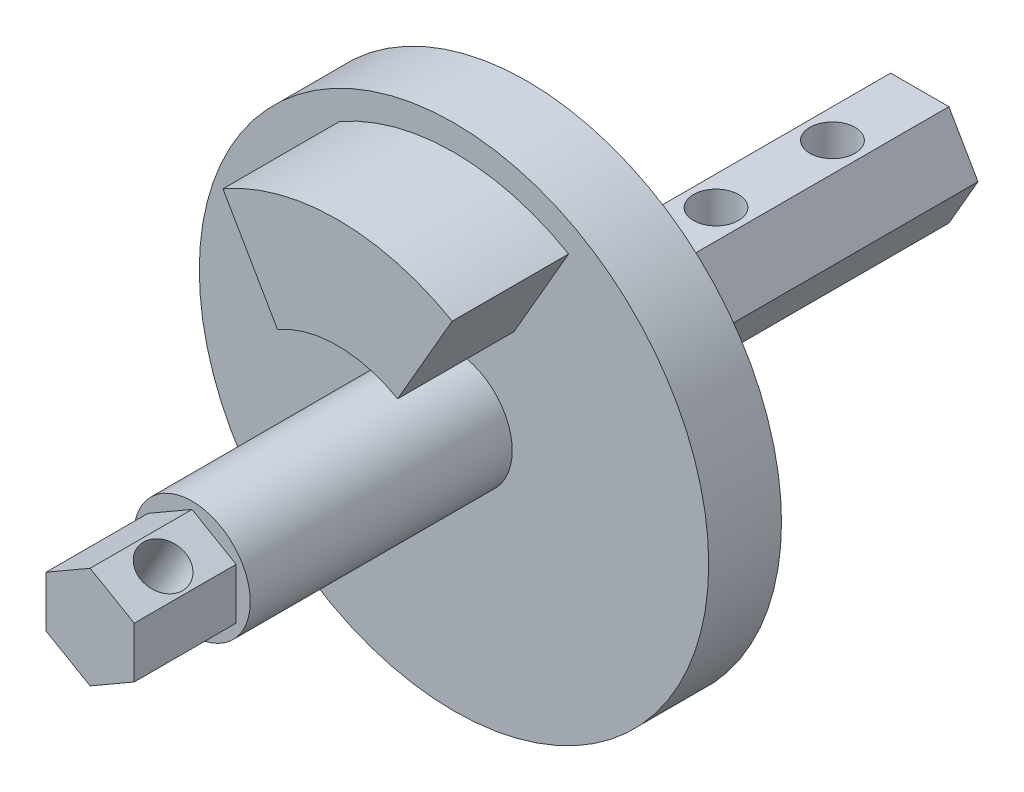
ISO-10303-21;
HEADER;
FILE_DESCRIPTION(('STEP AP214'),'2;1');
FILE_NAME('part.step','',(''),(''),'','','');
FILE_SCHEMA(('AUTOMOTIVE_DESIGN { 1 0 10303 214 1 1 1 1 }'));
ENDSEC;
DATA;
#1=APPLICATION_CONTEXT('core data for automotive mechanical design processes');
#2=APPLICATION_PROTOCOL_DEFINITION('international standard','automotive_design',2000,#1);
#3=PRODUCT_CONTEXT('',#1,'mechanical');
#4=PRODUCT('Part','Part','',(#3));
#5=PRODUCT_RELATED_PRODUCT_CATEGORY('part','',(#4));
#6=PRODUCT_DEFINITION_FORMATION('','',#4);
#7=PRODUCT_DEFINITION_CONTEXT('part definition',#1,'design');
#8=PRODUCT_DEFINITION('design','',#6,#7);
#9=PRODUCT_DEFINITION_SHAPE('','',#8);
#10=(LENGTH_UNIT() NAMED_UNIT(*) SI_UNIT(.MILLI.,.METRE.));
#11=(NAMED_UNIT(*) PLANE_ANGLE_UNIT() SI_UNIT($,.RADIAN.));
#12=(NAMED_UNIT(*) SI_UNIT($,.STERADIAN.) SOLID_ANGLE_UNIT());
#13=UNCERTAINTY_MEASURE_WITH_UNIT(LENGTH_MEASURE(1.E-05),#10,'distance_accuracy_value','');
#14=(GEOMETRIC_REPRESENTATION_CONTEXT(3) GLOBAL_UNCERTAINTY_ASSIGNED_CONTEXT((#13)) GLOBAL_UNIT_ASSIGNED_CONTEXT((#10,
#11,#12)) REPRESENTATION_CONTEXT('',''));
#15=CARTESIAN_POINT('',(0.,0.,0.));
#16=DIRECTION('',(0.,0.,1.));
#17=DIRECTION('',(1.,0.,0.));
#18=AXIS2_PLACEMENT_3D('',#15,#16,#17);
#19=CARTESIAN_POINT('',(0.,0.,-9.5));
#20=DIRECTION('',(0.,0.,-1.));
#21=DIRECTION('',(-1.,0.,0.));
#22=AXIS2_PLACEMENT_3D('',#19,#20,#21);
#23=PLANE('',#22);
#24=DIRECTION('',(-0.499999999999998,0.86602540378444,0.));
#25=VECTOR('',#24,1.);
#26=CARTESIAN_POINT('',(-2.00000000000002,-3.46410161513775,-9.5));
#27=LINE('',#26,#25);
#28=CARTESIAN_POINT('',(-2.00000000000001,-3.46410161513775,-9.5));
#29=VERTEX_POINT('',#28);
#30=CARTESIAN_POINT('',(-4.,0.,-9.5));
#31=VERTEX_POINT('',#30);
#32=EDGE_CURVE('E188',#29,#31,#27,.T.);
#33=ORIENTED_EDGE('',*,*,#32,.F.);
#34=CARTESIAN_POINT('',(0.,0.,-9.5));
#35=DIRECTION('',(0.,0.,-1.));
#36=DIRECTION('',(-1.,0.,0.));
#37=AXIS2_PLACEMENT_3D('',#34,#35,#36);
#38=CIRCLE('',#37,4.);
#39=EDGE_CURVE('E237',#29,#31,#38,.T.);
#40=ORIENTED_EDGE('',*,*,#39,.T.);
#41=EDGE_LOOP('',(#33,#40));
#42=FACE_BOUND('',#41,.T.);
#43=ADVANCED_FACE('F36',(#42),#23,.T.);
#44=DIRECTION('',(-1.,0.,0.));
#45=VECTOR('',#44,1.);
#46=CARTESIAN_POINT('',(1.99999999999999,-3.46410161513776,-9.5));
#47=LINE('',#46,#45);
#48=CARTESIAN_POINT('',(1.99999999999999,-3.46410161513776,-9.5));
#49=VERTEX_POINT('',#48);
#50=EDGE_CURVE('E193',#49,#29,#47,.T.);
#51=ORIENTED_EDGE('',*,*,#50,.F.);
#52=EDGE_CURVE('E355',#49,#29,#38,.T.);
#53=ORIENTED_EDGE('',*,*,#52,.T.);
#54=EDGE_LOOP('',(#51,#53));
#55=FACE_BOUND('',#54,.T.);
#56=ADVANCED_FACE('F298',(#55),#23,.T.);
#57=DIRECTION('',(-0.500000000000001,-0.866025403784438,0.));
#58=VECTOR('',#57,1.);
#59=CARTESIAN_POINT('',(4.,0.,-9.5));
#60=LINE('',#59,#58);
#61=CARTESIAN_POINT('',(4.,0.,-9.5));
#62=VERTEX_POINT('',#61);
#63=EDGE_CURVE('E215',#62,#49,#60,.T.);
#64=ORIENTED_EDGE('',*,*,#63,.F.);
#65=EDGE_CURVE('E357',#62,#49,#38,.T.);
#66=ORIENTED_EDGE('',*,*,#65,.T.);
#67=EDGE_LOOP('',(#64,#66));
#68=FACE_BOUND('',#67,.T.);
#69=ADVANCED_FACE('F305',(#68),#23,.T.);
#70=DIRECTION('',(0.499999999999998,-0.86602540378444,0.));
#71=VECTOR('',#70,1.);
#72=CARTESIAN_POINT('',(2.00000000000002,3.46410161513774,-9.5));
#73=LINE('',#72,#71);
#74=CARTESIAN_POINT('',(2.00000000000002,3.46410161513775,-9.5));
#75=VERTEX_POINT('',#74);
#76=EDGE_CURVE('E212',#75,#62,#73,.T.);
#77=ORIENTED_EDGE('',*,*,#76,.F.);
#78=EDGE_CURVE('E367',#75,#62,#38,.T.);
#79=ORIENTED_EDGE('',*,*,#78,.T.);
#80=EDGE_LOOP('',(#77,#79));
#81=FACE_BOUND('',#80,.T.);
#82=ADVANCED_FACE('F323',(#81),#23,.T.);
#83=DIRECTION('',(1.,0.,0.));
#84=VECTOR('',#83,1.);
#85=CARTESIAN_POINT('',(-1.99999999999999,3.46410161513776,-9.5));
#86=LINE('',#85,#84);
#87=CARTESIAN_POINT('',(-1.99999999999999,3.46410161513776,-9.5));
#88=VERTEX_POINT('',#87);
#89=EDGE_CURVE('E209',#88,#75,#86,.T.);
#90=ORIENTED_EDGE('',*,*,#89,.F.);
#91=EDGE_CURVE('E240',#88,#75,#38,.T.);
#92=ORIENTED_EDGE('',*,*,#91,.T.);
#93=EDGE_LOOP('',(#90,#92));
#94=FACE_BOUND('',#93,.T.);
#95=ADVANCED_FACE('F313',(#94),#23,.T.);
#96=CARTESIAN_POINT('',(0.,0.,2.5));
#97=DIRECTION('',(0.,0.,1.));
#98=DIRECTION('',(1.,0.,0.));
#99=AXIS2_PLACEMENT_3D('',#96,#97,#98);
#100=PLANE('',#99);
#101=CARTESIAN_POINT('',(0.,0.,2.5));
#102=DIRECTION('',(0.,0.,1.));
#103=DIRECTION('',(1.,0.,0.));
#104=AXIS2_PLACEMENT_3D('',#101,#102,#103);
#105=CIRCLE('',#104,4.);
#106=CARTESIAN_POINT('',(4.,0.,2.5));
#107=VERTEX_POINT('',#106);
#108=EDGE_CURVE('E239',#107,#107,#105,.T.);
#109=ORIENTED_EDGE('',*,*,#108,.F.);
#110=EDGE_LOOP('',(#109));
#111=FACE_BOUND('',#110,.T.);
#112=CARTESIAN_POINT('',(0.,0.,2.5));
#113=DIRECTION('',(0.,0.,1.));
#114=DIRECTION('',(1.,0.,0.));
#115=AXIS2_PLACEMENT_3D('',#112,#113,#114);
#116=CIRCLE('',#115,17.5);
#117=CARTESIAN_POINT('',(17.5,0.,2.5));
#118=VERTEX_POINT('',#117);
#119=EDGE_CURVE('E45',#118,#118,#116,.T.);
#120=ORIENTED_EDGE('',*,*,#119,.T.);
#121=EDGE_LOOP('',(#120));
#122=FACE_BOUND('',#121,.T.);
#123=DIRECTION('',(0.499999999999996,-0.866025403784441,0.));
#124=VECTOR('',#123,1.);
#125=CARTESIAN_POINT('',(-4.12499999999996,7.14470958122165,2.5));
#126=LINE('',#125,#124);
#127=CARTESIAN_POINT('',(-7.87499999999993,13.639900109605,2.5));
#128=VERTEX_POINT('',#127);
#129=CARTESIAN_POINT('',(-4.12499999999996,7.14470958122165,2.5));
#130=VERTEX_POINT('',#129);
#131=EDGE_CURVE('E261',#128,#130,#126,.T.);
#132=ORIENTED_EDGE('',*,*,#131,.F.);
#133=CARTESIAN_POINT('',(0.,0.,2.5));
#134=DIRECTION('',(0.,0.,1.));
#135=DIRECTION('',(-1.,0.,0.));
#136=AXIS2_PLACEMENT_3D('',#133,#134,#135);
#137=CIRCLE('',#136,15.75);
#138=CARTESIAN_POINT('',(7.87499999999993,13.639900109605,2.5));
#139=VERTEX_POINT('',#138);
#140=EDGE_CURVE('E245',#139,#128,#137,.T.);
#141=ORIENTED_EDGE('',*,*,#140,.F.);
#142=DIRECTION('',(0.499999999999995,0.866025403784441,0.));
#143=VECTOR('',#142,1.);
#144=CARTESIAN_POINT('',(7.87499999999993,13.639900109605,2.5));
#145=LINE('',#144,#143);
#146=CARTESIAN_POINT('',(4.12499999999996,7.14470958122164,2.5));
#147=VERTEX_POINT('',#146);
#148=EDGE_CURVE('E252',#147,#139,#145,.T.);
#149=ORIENTED_EDGE('',*,*,#148,.F.);
#150=CARTESIAN_POINT('',(0.,0.,2.5));
#151=DIRECTION('',(0.,0.,-1.));
#152=DIRECTION('',(1.,0.,0.));
#153=AXIS2_PLACEMENT_3D('',#150,#151,#152);
#154=CIRCLE('',#153,8.25);
#155=EDGE_CURVE('E263',#130,#147,#154,.T.);
#156=ORIENTED_EDGE('',*,*,#155,.F.);
#157=EDGE_LOOP('',(#132,#141,#149,#156));
#158=FACE_BOUND('',#157,.T.);
#159=ADVANCED_FACE('F293',(#111,#122,#158),#100,.T.);
#160=CARTESIAN_POINT('',(0.,0.,2.5));
#161=DIRECTION('',(0.,0.,-1.));
#162=DIRECTION('',(-1.,0.,0.));
#163=AXIS2_PLACEMENT_3D('',#160,#161,#162);
#164=CYLINDRICAL_SURFACE('',#163,17.5);
#165=ORIENTED_EDGE('',*,*,#119,.F.);
#166=EDGE_LOOP('',(#165));
#167=FACE_BOUND('',#166,.T.);
#168=CARTESIAN_POINT('',(0.,0.,-2.5));
#169=DIRECTION('',(0.,0.,1.));
#170=DIRECTION('',(1.,0.,0.));
#171=AXIS2_PLACEMENT_3D('',#168,#169,#170);
#172=CIRCLE('',#171,17.5);
#173=CARTESIAN_POINT('',(17.5,0.,-2.5));
#174=VERTEX_POINT('',#173);
#175=EDGE_CURVE('E40',#174,#174,#172,.T.);
#176=ORIENTED_EDGE('',*,*,#175,.T.);
#177=EDGE_LOOP('',(#176));
#178=FACE_BOUND('',#177,.T.);
#179=ADVANCED_FACE('F38',(#167,#178),#164,.T.);
#180=CARTESIAN_POINT('',(0.,0.,-2.5));
#181=DIRECTION('',(0.,0.,1.));
#182=DIRECTION('',(1.,0.,0.));
#183=AXIS2_PLACEMENT_3D('',#180,#181,#182);
#184=PLANE('',#183);
#185=CARTESIAN_POINT('',(0.,0.,-2.5));
#186=DIRECTION('',(0.,0.,-1.));
#187=DIRECTION('',(-1.,0.,0.));
#188=AXIS2_PLACEMENT_3D('',#185,#186,#187);
#189=CIRCLE('',#188,4.);
#190=CARTESIAN_POINT('',(-4.,0.,-2.5));
#191=VERTEX_POINT('',#190);
#192=EDGE_CURVE('E11',#191,#191,#189,.T.);
#193=ORIENTED_EDGE('',*,*,#192,.F.);
#194=EDGE_LOOP('',(#193));
#195=FACE_BOUND('',#194,.T.);
#196=ORIENTED_EDGE('',*,*,#175,.F.);
#197=EDGE_LOOP('',(#196));
#198=FACE_BOUND('',#197,.T.);
#199=ADVANCED_FACE('F282',(#195,#198),#184,.F.);
#200=CARTESIAN_POINT('',(0.,0.,10.5));
#201=DIRECTION('',(0.,0.,-1.));
#202=DIRECTION('',(-1.,0.,0.));
#203=AXIS2_PLACEMENT_3D('',#200,#201,#202);
#204=CYLINDRICAL_SURFACE('',#203,15.75);
#205=ORIENTED_EDGE('',*,*,#140,.T.);
#206=DIRECTION('',(0.,0.,-1.));
#207=VECTOR('',#206,1.);
#208=CARTESIAN_POINT('',(-7.87499999999993,13.639900109605,10.5));
#209=LINE('',#208,#207);
#210=CARTESIAN_POINT('',(-7.87499999999993,13.639900109605,10.5));
#211=VERTEX_POINT('',#210);
#212=EDGE_CURVE('E274',#211,#128,#209,.T.);
#213=ORIENTED_EDGE('',*,*,#212,.F.);
#214=CARTESIAN_POINT('',(0.,0.,10.5));
#215=DIRECTION('',(0.,0.,1.));
#216=DIRECTION('',(-1.,0.,0.));
#217=AXIS2_PLACEMENT_3D('',#214,#215,#216);
#218=CIRCLE('',#217,15.75);
#219=CARTESIAN_POINT('',(7.87499999999993,13.639900109605,10.5));
#220=VERTEX_POINT('',#219);
#221=EDGE_CURVE('E248',#220,#211,#218,.T.);
#222=ORIENTED_EDGE('',*,*,#221,.F.);
#223=DIRECTION('',(0.,0.,-1.));
#224=VECTOR('',#223,1.);
#225=CARTESIAN_POINT('',(7.87499999999993,13.639900109605,10.5));
#226=LINE('',#225,#224);
#227=EDGE_CURVE('E258',#220,#139,#226,.T.);
#228=ORIENTED_EDGE('',*,*,#227,.T.);
#229=EDGE_LOOP('',(#205,#213,#222,#228));
#230=FACE_BOUND('',#229,.T.);
#231=ADVANCED_FACE('F284',(#230),#204,.T.);
#232=CARTESIAN_POINT('',(-4.12499999999996,7.14470958122165,10.5));
#233=DIRECTION('',(0.866025403784441,0.499999999999996,0.));
#234=DIRECTION('',(-0.499999999999996,0.866025403784441,0.));
#235=AXIS2_PLACEMENT_3D('',#232,#233,#234);
#236=PLANE('',#235);
#237=ORIENTED_EDGE('',*,*,#131,.T.);
#238=DIRECTION('',(0.,0.,-1.));
#239=VECTOR('',#238,1.);
#240=CARTESIAN_POINT('',(-4.12499999999996,7.14470958122165,10.5));
#241=LINE('',#240,#239);
#242=CARTESIAN_POINT('',(-4.12499999999996,7.14470958122165,10.5));
#243=VERTEX_POINT('',#242);
#244=EDGE_CURVE('E271',#243,#130,#241,.T.);
#245=ORIENTED_EDGE('',*,*,#244,.F.);
#246=DIRECTION('',(0.499999999999996,-0.866025403784441,0.));
#247=VECTOR('',#246,1.);
#248=CARTESIAN_POINT('',(-4.12499999999996,7.14470958122165,10.5));
#249=LINE('',#248,#247);
#250=EDGE_CURVE('E251',#211,#243,#249,.T.);
#251=ORIENTED_EDGE('',*,*,#250,.F.);
#252=ORIENTED_EDGE('',*,*,#212,.T.);
#253=EDGE_LOOP('',(#237,#245,#251,#252));
#254=FACE_BOUND('',#253,.T.);
#255=ADVANCED_FACE('F290',(#254),#236,.F.);
#256=CARTESIAN_POINT('',(0.,0.,10.5));
#257=DIRECTION('',(0.,0.,-1.));
#258=DIRECTION('',(-1.,0.,0.));
#259=AXIS2_PLACEMENT_3D('',#256,#257,#258);
#260=CYLINDRICAL_SURFACE('',#259,8.25);
#261=ORIENTED_EDGE('',*,*,#155,.T.);
#262=DIRECTION('',(0.,0.,-1.));
#263=VECTOR('',#262,1.);
#264=CARTESIAN_POINT('',(4.12499999999996,7.14470958122164,10.5));
#265=LINE('',#264,#263);
#266=CARTESIAN_POINT('',(4.12499999999996,7.14470958122164,10.5));
#267=VERTEX_POINT('',#266);
#268=EDGE_CURVE('E269',#267,#147,#265,.T.);
#269=ORIENTED_EDGE('',*,*,#268,.F.);
#270=CARTESIAN_POINT('',(0.,0.,10.5));
#271=DIRECTION('',(0.,0.,-1.));
#272=DIRECTION('',(1.,0.,0.));
#273=AXIS2_PLACEMENT_3D('',#270,#271,#272);
#274=CIRCLE('',#273,8.25);
#275=EDGE_CURVE('E254',#243,#267,#274,.T.);
#276=ORIENTED_EDGE('',*,*,#275,.F.);
#277=ORIENTED_EDGE('',*,*,#244,.T.);
#278=EDGE_LOOP('',(#261,#269,#276,#277));
#279=FACE_BOUND('',#278,.T.);
#280=ADVANCED_FACE('F577',(#279),#260,.F.);
#281=CARTESIAN_POINT('',(7.87499999999993,13.639900109605,10.5));
#282=DIRECTION('',(-0.866025403784441,0.499999999999995,0.));
#283=DIRECTION('',(-0.499999999999995,-0.866025403784441,0.));
#284=AXIS2_PLACEMENT_3D('',#281,#282,#283);
#285=PLANE('',#284);
#286=ORIENTED_EDGE('',*,*,#148,.T.);
#287=ORIENTED_EDGE('',*,*,#227,.F.);
#288=DIRECTION('',(0.499999999999995,0.866025403784441,0.));
#289=VECTOR('',#288,1.);
#290=CARTESIAN_POINT('',(7.87499999999993,13.639900109605,10.5));
#291=LINE('',#290,#289);
#292=EDGE_CURVE('E256',#267,#220,#291,.T.);
#293=ORIENTED_EDGE('',*,*,#292,.F.);
#294=ORIENTED_EDGE('',*,*,#268,.T.);
#295=EDGE_LOOP('',(#286,#287,#293,#294));
#296=FACE_BOUND('',#295,.T.);
#297=ADVANCED_FACE('F584',(#296),#285,.F.);
#298=CARTESIAN_POINT('',(0.,0.,10.5));
#299=DIRECTION('',(0.,0.,-1.));
#300=DIRECTION('',(-1.,0.,0.));
#301=AXIS2_PLACEMENT_3D('',#298,#299,#300);
#302=PLANE('',#301);
#303=ORIENTED_EDGE('',*,*,#221,.T.);
#304=ORIENTED_EDGE('',*,*,#250,.T.);
#305=ORIENTED_EDGE('',*,*,#275,.T.);
#306=ORIENTED_EDGE('',*,*,#292,.T.);
#307=EDGE_LOOP('',(#303,#304,#305,#306));
#308=FACE_BOUND('',#307,.T.);
#309=ADVANCED_FACE('F564',(#308),#302,.F.);
#310=CARTESIAN_POINT('',(0.,0.,20.5));
#311=DIRECTION('',(0.,0.,-1.));
#312=DIRECTION('',(-1.,0.,0.));
#313=AXIS2_PLACEMENT_3D('',#310,#311,#312);
#314=CYLINDRICAL_SURFACE('',#313,4.);
#315=CARTESIAN_POINT('',(0.,0.,20.5));
#316=DIRECTION('',(0.,0.,1.));
#317=DIRECTION('',(1.,0.,0.));
#318=AXIS2_PLACEMENT_3D('',#315,#316,#317);
#319=CIRCLE('',#318,4.);
#320=CARTESIAN_POINT('',(4.,0.,20.5));
#321=VERTEX_POINT('',#320);
#322=EDGE_CURVE('E242',#321,#321,#319,.T.);
#323=ORIENTED_EDGE('',*,*,#322,.F.);
#324=EDGE_LOOP('',(#323));
#325=FACE_BOUND('',#324,.T.);
#326=ORIENTED_EDGE('',*,*,#108,.T.);
#327=EDGE_LOOP('',(#326));
#328=FACE_BOUND('',#327,.T.);
#329=ADVANCED_FACE('F436',(#325,#328),#314,.T.);
#330=CARTESIAN_POINT('',(0.,0.,20.5));
#331=DIRECTION('',(0.,0.,1.));
#332=DIRECTION('',(1.,0.,0.));
#333=AXIS2_PLACEMENT_3D('',#330,#331,#332);
#334=PLANE('',#333);
#335=DIRECTION('',(0.,1.,0.));
#336=VECTOR('',#335,1.);
#337=CARTESIAN_POINT('',(3.03108891324555,-1.74999999999998,20.5));
#338=LINE('',#337,#336);
#339=CARTESIAN_POINT('',(3.03108891324555,-1.74999999999998,20.5));
#340=VERTEX_POINT('',#339);
#341=CARTESIAN_POINT('',(3.03108891324555,1.74999999999998,20.5));
#342=VERTEX_POINT('',#341);
#343=EDGE_CURVE('E53',#340,#342,#338,.T.);
#344=ORIENTED_EDGE('',*,*,#343,.F.);
#345=DIRECTION('',(0.866025403784437,0.500000000000003,0.));
#346=VECTOR('',#345,1.);
#347=CARTESIAN_POINT('',(0.,-3.5,20.5));
#348=LINE('',#347,#346);
#349=CARTESIAN_POINT('',(0.,-3.5,20.5));
#350=VERTEX_POINT('',#349);
#351=EDGE_CURVE('E57',#350,#340,#348,.T.);
#352=ORIENTED_EDGE('',*,*,#351,.F.);
#353=DIRECTION('',(0.866025403784437,-0.500000000000003,0.));
#354=VECTOR('',#353,1.);
#355=CARTESIAN_POINT('',(-3.03108891324555,-1.74999999999998,20.5));
#356=LINE('',#355,#354);
#357=CARTESIAN_POINT('',(-3.03108891324555,-1.74999999999998,20.5));
#358=VERTEX_POINT('',#357);
#359=EDGE_CURVE('E544',#358,#350,#356,.T.);
#360=ORIENTED_EDGE('',*,*,#359,.F.);
#361=DIRECTION('',(0.,-1.,0.));
#362=VECTOR('',#361,1.);
#363=CARTESIAN_POINT('',(-3.03108891324555,1.74999999999998,20.5));
#364=LINE('',#363,#362);
#365=CARTESIAN_POINT('',(-3.03108891324555,1.74999999999998,20.5));
#366=VERTEX_POINT('',#365);
#367=EDGE_CURVE('E541',#366,#358,#364,.T.);
#368=ORIENTED_EDGE('',*,*,#367,.F.);
#369=DIRECTION('',(-0.866025403784437,-0.500000000000003,0.));
#370=VECTOR('',#369,1.);
#371=CARTESIAN_POINT('',(0.,3.5,20.5));
#372=LINE('',#371,#370);
#373=CARTESIAN_POINT('',(0.,3.5,20.5));
#374=VERTEX_POINT('',#373);
#375=EDGE_CURVE('E538',#374,#366,#372,.T.);
#376=ORIENTED_EDGE('',*,*,#375,.F.);
#377=DIRECTION('',(-0.866025403784437,0.500000000000003,0.));
#378=VECTOR('',#377,1.);
#379=CARTESIAN_POINT('',(3.03108891324555,1.74999999999998,20.5));
#380=LINE('',#379,#378);
#381=EDGE_CURVE('E526',#342,#374,#380,.T.);
#382=ORIENTED_EDGE('',*,*,#381,.F.);
#383=EDGE_LOOP('',(#344,#352,#360,#368,#376,#382));
#384=FACE_BOUND('',#383,.T.);
#385=ORIENTED_EDGE('',*,*,#322,.T.);
#386=EDGE_LOOP('',(#385));
#387=FACE_BOUND('',#386,.T.);
#388=ADVANCED_FACE('F320',(#384,#387),#334,.T.);
#389=CARTESIAN_POINT('',(0.,0.,-9.5));
#390=DIRECTION('',(0.,0.,1.));
#391=DIRECTION('',(1.,0.,0.));
#392=AXIS2_PLACEMENT_3D('',#389,#390,#391);
#393=CYLINDRICAL_SURFACE('',#392,4.);
#394=EDGE_CURVE('E238',#31,#88,#38,.T.);
#395=ORIENTED_EDGE('',*,*,#394,.F.);
#396=ORIENTED_EDGE('',*,*,#39,.F.);
#397=ORIENTED_EDGE('',*,*,#52,.F.);
#398=ORIENTED_EDGE('',*,*,#65,.F.);
#399=ORIENTED_EDGE('',*,*,#78,.F.);
#400=ORIENTED_EDGE('',*,*,#91,.F.);
#401=EDGE_LOOP('',(#395,#396,#397,#398,#399,#400));
#402=FACE_BOUND('',#401,.T.);
#403=ORIENTED_EDGE('',*,*,#192,.T.);
#404=EDGE_LOOP('',(#403));
#405=FACE_BOUND('',#404,.T.);
#406=ADVANCED_FACE('F311',(#402,#405),#393,.T.);
#407=DIRECTION('',(0.500000000000001,0.866025403784438,0.));
#408=VECTOR('',#407,1.);
#409=CARTESIAN_POINT('',(-4.,0.,-9.5));
#410=LINE('',#409,#408);
#411=EDGE_CURVE('E206',#31,#88,#410,.T.);
#412=ORIENTED_EDGE('',*,*,#411,.F.);
#413=ORIENTED_EDGE('',*,*,#394,.T.);
#414=EDGE_LOOP('',(#412,#413));
#415=FACE_BOUND('',#414,.T.);
#416=ADVANCED_FACE('F301',(#415),#23,.T.);
#417=CARTESIAN_POINT('',(-2.00000000000002,-3.46410161513775,-29.5));
#418=DIRECTION('',(0.86602540378444,0.499999999999997,0.));
#419=DIRECTION('',(-0.499999999999998,0.86602540378444,0.));
#420=AXIS2_PLACEMENT_3D('',#417,#418,#419);
#421=PLANE('',#420);
#422=ORIENTED_EDGE('',*,*,#32,.T.);
#423=DIRECTION('',(0.,0.,1.));
#424=VECTOR('',#423,1.);
#425=CARTESIAN_POINT('',(-4.,0.,-29.5));
#426=LINE('',#425,#424);
#427=CARTESIAN_POINT('',(-4.,0.,-29.5));
#428=VERTEX_POINT('',#427);
#429=EDGE_CURVE('E234',#428,#31,#426,.T.);
#430=ORIENTED_EDGE('',*,*,#429,.F.);
#431=DIRECTION('',(-0.499999999999998,0.86602540378444,0.));
#432=VECTOR('',#431,1.);
#433=CARTESIAN_POINT('',(-2.00000000000002,-3.46410161513775,-29.5));
#434=LINE('',#433,#432);
#435=CARTESIAN_POINT('',(-2.00000000000002,-3.46410161513775,-29.5));
#436=VERTEX_POINT('',#435);
#437=EDGE_CURVE('E189',#436,#428,#434,.T.);
#438=ORIENTED_EDGE('',*,*,#437,.F.);
#439=DIRECTION('',(0.,0.,1.));
#440=VECTOR('',#439,1.);
#441=CARTESIAN_POINT('',(-2.00000000000002,-3.46410161513775,-29.5));
#442=LINE('',#441,#440);
#443=EDGE_CURVE('E203',#436,#29,#442,.T.);
#444=ORIENTED_EDGE('',*,*,#443,.T.);
#445=EDGE_LOOP('',(#422,#430,#438,#444));
#446=FACE_BOUND('',#445,.T.);
#447=ADVANCED_FACE('F310',(#446),#421,.F.);
#448=CARTESIAN_POINT('',(-4.,0.,-29.5));
#449=DIRECTION('',(0.866025403784438,-0.500000000000001,0.));
#450=DIRECTION('',(0.500000000000001,0.866025403784438,0.));
#451=AXIS2_PLACEMENT_3D('',#448,#449,#450);
#452=PLANE('',#451);
#453=ORIENTED_EDGE('',*,*,#411,.T.);
#454=DIRECTION('',(0.,0.,1.));
#455=VECTOR('',#454,1.);
#456=CARTESIAN_POINT('',(-1.99999999999999,3.46410161513776,-29.5));
#457=LINE('',#456,#455);
#458=CARTESIAN_POINT('',(-1.99999999999999,3.46410161513776,-29.5));
#459=VERTEX_POINT('',#458);
#460=EDGE_CURVE('E231',#459,#88,#457,.T.);
#461=ORIENTED_EDGE('',*,*,#460,.F.);
#462=DIRECTION('',(0.500000000000001,0.866025403784438,0.));
#463=VECTOR('',#462,1.);
#464=CARTESIAN_POINT('',(-4.,0.,-29.5));
#465=LINE('',#464,#463);
#466=EDGE_CURVE('E192',#428,#459,#465,.T.);
#467=ORIENTED_EDGE('',*,*,#466,.F.);
#468=ORIENTED_EDGE('',*,*,#429,.T.);
#469=EDGE_LOOP('',(#453,#461,#467,#468));
#470=FACE_BOUND('',#469,.T.);
#471=ADVANCED_FACE('F318',(#470),#452,.F.);
#472=CARTESIAN_POINT('',(-1.99999999999999,3.46410161513776,-29.5));
#473=DIRECTION('',(0.,-1.,0.));
#474=DIRECTION('',(1.,0.,0.));
#475=AXIS2_PLACEMENT_3D('',#472,#473,#474);
#476=PLANE('',#475);
#477=CARTESIAN_POINT('',(0.,3.46410161513775,-15.5));
#478=DIRECTION('',(0.,-1.,0.));
#479=DIRECTION('',(1.,0.,0.));
#480=AXIS2_PLACEMENT_3D('',#477,#478,#479);
#481=CIRCLE('',#480,1.55);
#482=CARTESIAN_POINT('',(1.55000000000001,3.46410161513775,-15.5));
#483=VERTEX_POINT('',#482);
#484=EDGE_CURVE('E185',#483,#483,#481,.F.);
#485=ORIENTED_EDGE('',*,*,#484,.F.);
#486=EDGE_LOOP('',(#485));
#487=FACE_BOUND('',#486,.T.);
#488=CARTESIAN_POINT('',(0.,3.46410161513775,-23.5));
#489=DIRECTION('',(0.,-1.,0.));
#490=DIRECTION('',(1.,0.,0.));
#491=AXIS2_PLACEMENT_3D('',#488,#489,#490);
#492=CIRCLE('',#491,1.55000000000003);
#493=CARTESIAN_POINT('',(1.55000000000004,3.46410161513775,-23.5));
#494=VERTEX_POINT('',#493);
#495=EDGE_CURVE('E181',#494,#494,#492,.F.);
#496=ORIENTED_EDGE('',*,*,#495,.F.);
#497=EDGE_LOOP('',(#496));
#498=FACE_BOUND('',#497,.T.);
#499=ORIENTED_EDGE('',*,*,#89,.T.);
#500=DIRECTION('',(0.,0.,1.));
#501=VECTOR('',#500,1.);
#502=CARTESIAN_POINT('',(2.00000000000002,3.46410161513774,-29.5));
#503=LINE('',#502,#501);
#504=CARTESIAN_POINT('',(2.00000000000002,3.46410161513774,-29.5));
#505=VERTEX_POINT('',#504);
#506=EDGE_CURVE('E228',#505,#75,#503,.T.);
#507=ORIENTED_EDGE('',*,*,#506,.F.);
#508=DIRECTION('',(1.,0.,0.));
#509=VECTOR('',#508,1.);
#510=CARTESIAN_POINT('',(-1.99999999999999,3.46410161513776,-29.5));
#511=LINE('',#510,#509);
#512=EDGE_CURVE('E195',#459,#505,#511,.T.);
#513=ORIENTED_EDGE('',*,*,#512,.F.);
#514=ORIENTED_EDGE('',*,*,#460,.T.);
#515=EDGE_LOOP('',(#499,#507,#513,#514));
#516=FACE_BOUND('',#515,.T.);
#517=ADVANCED_FACE('F341',(#487,#498,#516),#476,.F.);
#518=CARTESIAN_POINT('',(2.00000000000002,3.46410161513774,-29.5));
#519=DIRECTION('',(-0.86602540378444,-0.499999999999998,0.));
#520=DIRECTION('',(0.499999999999998,-0.86602540378444,0.));
#521=AXIS2_PLACEMENT_3D('',#518,#519,#520);
#522=PLANE('',#521);
#523=ORIENTED_EDGE('',*,*,#76,.T.);
#524=DIRECTION('',(0.,0.,1.));
#525=VECTOR('',#524,1.);
#526=CARTESIAN_POINT('',(4.,0.,-29.5));
#527=LINE('',#526,#525);
#528=CARTESIAN_POINT('',(4.,0.,-29.5));
#529=VERTEX_POINT('',#528);
#530=EDGE_CURVE('E225',#529,#62,#527,.T.);
#531=ORIENTED_EDGE('',*,*,#530,.F.);
#532=DIRECTION('',(0.499999999999998,-0.86602540378444,0.));
#533=VECTOR('',#532,1.);
#534=CARTESIAN_POINT('',(2.00000000000002,3.46410161513774,-29.5));
#535=LINE('',#534,#533);
#536=EDGE_CURVE('E197',#505,#529,#535,.T.);
#537=ORIENTED_EDGE('',*,*,#536,.F.);
#538=ORIENTED_EDGE('',*,*,#506,.T.);
#539=EDGE_LOOP('',(#523,#531,#537,#538));
#540=FACE_BOUND('',#539,.T.);
#541=ADVANCED_FACE('F369',(#540),#522,.F.);
#542=CARTESIAN_POINT('',(4.,0.,-29.5));
#543=DIRECTION('',(-0.866025403784438,0.500000000000001,0.));
#544=DIRECTION('',(-0.500000000000001,-0.866025403784438,0.));
#545=AXIS2_PLACEMENT_3D('',#542,#543,#544);
#546=PLANE('',#545);
#547=ORIENTED_EDGE('',*,*,#63,.T.);
#548=DIRECTION('',(0.,0.,1.));
#549=VECTOR('',#548,1.);
#550=CARTESIAN_POINT('',(1.99999999999999,-3.46410161513776,-29.5));
#551=LINE('',#550,#549);
#552=CARTESIAN_POINT('',(1.99999999999999,-3.46410161513776,-29.5));
#553=VERTEX_POINT('',#552);
#554=EDGE_CURVE('E222',#553,#49,#551,.T.);
#555=ORIENTED_EDGE('',*,*,#554,.F.);
#556=DIRECTION('',(-0.500000000000001,-0.866025403784438,0.));
#557=VECTOR('',#556,1.);
#558=CARTESIAN_POINT('',(4.,0.,-29.5));
#559=LINE('',#558,#557);
#560=EDGE_CURVE('E199',#529,#553,#559,.T.);
#561=ORIENTED_EDGE('',*,*,#560,.F.);
#562=ORIENTED_EDGE('',*,*,#530,.T.);
#563=EDGE_LOOP('',(#547,#555,#561,#562));
#564=FACE_BOUND('',#563,.T.);
#565=ADVANCED_FACE('F363',(#564),#546,.F.);
#566=CARTESIAN_POINT('',(1.99999999999999,-3.46410161513776,-29.5));
#567=DIRECTION('',(0.,1.,0.));
#568=DIRECTION('',(-1.,0.,0.));
#569=AXIS2_PLACEMENT_3D('',#566,#567,#568);
#570=PLANE('',#569);
#571=CARTESIAN_POINT('',(0.,-3.46410161513775,-15.5));
#572=DIRECTION('',(0.,1.,0.));
#573=DIRECTION('',(-1.,0.,0.));
#574=AXIS2_PLACEMENT_3D('',#571,#572,#573);
#575=CIRCLE('',#574,1.55);
#576=CARTESIAN_POINT('',(-1.55000000000001,-3.46410161513775,-15.5));
#577=VERTEX_POINT('',#576);
#578=EDGE_CURVE('E174',#577,#577,#575,.T.);
#579=ORIENTED_EDGE('',*,*,#578,.T.);
#580=EDGE_LOOP('',(#579));
#581=FACE_BOUND('',#580,.T.);
#582=CARTESIAN_POINT('',(0.,-3.46410161513775,-23.5));
#583=DIRECTION('',(0.,1.,0.));
#584=DIRECTION('',(-1.,0.,0.));
#585=AXIS2_PLACEMENT_3D('',#582,#583,#584);
#586=CIRCLE('',#585,1.55000000000003);
#587=CARTESIAN_POINT('',(-1.55000000000004,-3.46410161513775,-23.5));
#588=VERTEX_POINT('',#587);
#589=EDGE_CURVE('E171',#588,#588,#586,.T.);
#590=ORIENTED_EDGE('',*,*,#589,.T.);
#591=EDGE_LOOP('',(#590));
#592=FACE_BOUND('',#591,.T.);
#593=ORIENTED_EDGE('',*,*,#50,.T.);
#594=ORIENTED_EDGE('',*,*,#443,.F.);
#595=DIRECTION('',(-1.,0.,0.));
#596=VECTOR('',#595,1.);
#597=CARTESIAN_POINT('',(1.99999999999999,-3.46410161513776,-29.5));
#598=LINE('',#597,#596);
#599=EDGE_CURVE('E201',#553,#436,#598,.T.);
#600=ORIENTED_EDGE('',*,*,#599,.F.);
#601=ORIENTED_EDGE('',*,*,#554,.T.);
#602=EDGE_LOOP('',(#593,#594,#600,#601));
#603=FACE_BOUND('',#602,.T.);
#604=ADVANCED_FACE('F359',(#581,#592,#603),#570,.F.);
#605=CARTESIAN_POINT('',(0.,0.,-29.5));
#606=DIRECTION('',(0.,0.,-1.));
#607=DIRECTION('',(-1.,0.,0.));
#608=AXIS2_PLACEMENT_3D('',#605,#606,#607);
#609=PLANE('',#608);
#610=ORIENTED_EDGE('',*,*,#437,.T.);
#611=ORIENTED_EDGE('',*,*,#466,.T.);
#612=ORIENTED_EDGE('',*,*,#512,.T.);
#613=ORIENTED_EDGE('',*,*,#536,.T.);
#614=ORIENTED_EDGE('',*,*,#560,.T.);
#615=ORIENTED_EDGE('',*,*,#599,.T.);
#616=EDGE_LOOP('',(#610,#611,#612,#613,#614,#615));
#617=FACE_BOUND('',#616,.T.);
#618=ADVANCED_FACE('F344',(#617),#609,.T.);
#619=CARTESIAN_POINT('',(0.,3.53589838486225,-23.5));
#620=DIRECTION('',(0.,-1.,0.));
#621=DIRECTION('',(1.,0.,0.));
#622=AXIS2_PLACEMENT_3D('',#619,#620,#621);
#623=CYLINDRICAL_SURFACE('',#622,1.55000000000003);
#624=ORIENTED_EDGE('',*,*,#589,.F.);
#625=EDGE_LOOP('',(#624));
#626=FACE_BOUND('',#625,.T.);
#627=ORIENTED_EDGE('',*,*,#495,.T.);
#628=EDGE_LOOP('',(#627));
#629=FACE_BOUND('',#628,.T.);
#630=ADVANCED_FACE('F410',(#626,#629),#623,.F.);
#631=CARTESIAN_POINT('',(0.,3.53589838486225,-15.5));
#632=DIRECTION('',(0.,-1.,0.));
#633=DIRECTION('',(1.,0.,0.));
#634=AXIS2_PLACEMENT_3D('',#631,#632,#633);
#635=CYLINDRICAL_SURFACE('',#634,1.55);
#636=ORIENTED_EDGE('',*,*,#578,.F.);
#637=EDGE_LOOP('',(#636));
#638=FACE_BOUND('',#637,.T.);
#639=ORIENTED_EDGE('',*,*,#484,.T.);
#640=EDGE_LOOP('',(#639));
#641=FACE_BOUND('',#640,.T.);
#642=ADVANCED_FACE('F415',(#638,#641),#635,.F.);
#643=CARTESIAN_POINT('',(3.03108891324555,-1.74999999999998,27.5));
#644=DIRECTION('',(-1.,0.,0.));
#645=DIRECTION('',(0.,-1.,0.));
#646=AXIS2_PLACEMENT_3D('',#643,#644,#645);
#647=PLANE('',#646);
#648=ORIENTED_EDGE('',*,*,#343,.T.);
#649=DIRECTION('',(0.,0.,-1.));
#650=VECTOR('',#649,1.);
#651=CARTESIAN_POINT('',(3.03108891324555,1.74999999999998,27.5));
#652=LINE('',#651,#650);
#653=CARTESIAN_POINT('',(3.03108891324555,1.74999999999998,27.5));
#654=VERTEX_POINT('',#653);
#655=EDGE_CURVE('E154',#654,#342,#652,.T.);
#656=ORIENTED_EDGE('',*,*,#655,.F.);
#657=DIRECTION('',(0.,1.,0.));
#658=VECTOR('',#657,1.);
#659=CARTESIAN_POINT('',(3.03108891324555,-1.74999999999998,27.5));
#660=LINE('',#659,#658);
#661=CARTESIAN_POINT('',(3.03108891324555,-1.74999999999998,27.5));
#662=VERTEX_POINT('',#661);
#663=EDGE_CURVE('E160',#662,#654,#660,.T.);
#664=ORIENTED_EDGE('',*,*,#663,.F.);
#665=DIRECTION('',(0.,0.,-1.));
#666=VECTOR('',#665,1.);
#667=CARTESIAN_POINT('',(3.03108891324555,-1.74999999999998,27.5));
#668=LINE('',#667,#666);
#669=EDGE_CURVE('E535',#662,#340,#668,.T.);
#670=ORIENTED_EDGE('',*,*,#669,.T.);
#671=EDGE_LOOP('',(#648,#656,#664,#670));
#672=FACE_BOUND('',#671,.T.);
#673=ADVANCED_FACE('F170',(#672),#647,.F.);
#674=CARTESIAN_POINT('',(3.03108891324555,1.74999999999998,27.5));
#675=DIRECTION('',(-0.500000000000003,-0.866025403784437,0.));
#676=DIRECTION('',(0.866025403784437,-0.500000000000003,0.));
#677=AXIS2_PLACEMENT_3D('',#674,#675,#676);
#678=PLANE('',#677);
#679=CARTESIAN_POINT('',(1.51554445662277,2.62499999999999,24.));
#680=DIRECTION('',(-0.500000000000003,-0.866025403784437,0.));
#681=DIRECTION('',(0.866025403784437,-0.500000000000003,0.));
#682=AXIS2_PLACEMENT_3D('',#679,#680,#681);
#683=CIRCLE('',#682,1.55);
#684=CARTESIAN_POINT('',(2.85788383248865,1.84999999999999,24.));
#685=VERTEX_POINT('',#684);
#686=EDGE_CURVE('E524',#685,#685,#683,.T.);
#687=ORIENTED_EDGE('',*,*,#686,.T.);
#688=EDGE_LOOP('',(#687));
#689=FACE_BOUND('',#688,.T.);
#690=ORIENTED_EDGE('',*,*,#381,.T.);
#691=DIRECTION('',(0.,0.,-1.));
#692=VECTOR('',#691,1.);
#693=CARTESIAN_POINT('',(0.,3.5,27.5));
#694=LINE('',#693,#692);
#695=CARTESIAN_POINT('',(0.,3.5,27.5));
#696=VERTEX_POINT('',#695);
#697=EDGE_CURVE('E156',#696,#374,#694,.T.);
#698=ORIENTED_EDGE('',*,*,#697,.F.);
#699=DIRECTION('',(-0.866025403784437,0.500000000000003,0.));
#700=VECTOR('',#699,1.);
#701=CARTESIAN_POINT('',(3.03108891324555,1.74999999999998,27.5));
#702=LINE('',#701,#700);
#703=EDGE_CURVE('E149',#654,#696,#702,.T.);
#704=ORIENTED_EDGE('',*,*,#703,.F.);
#705=ORIENTED_EDGE('',*,*,#655,.T.);
#706=EDGE_LOOP('',(#690,#698,#704,#705));
#707=FACE_BOUND('',#706,.T.);
#708=ADVANCED_FACE('F152',(#689,#707),#678,.F.);
#709=CARTESIAN_POINT('',(0.,3.5,27.5));
#710=DIRECTION('',(0.500000000000003,-0.866025403784437,0.));
#711=DIRECTION('',(0.866025403784437,0.500000000000003,0.));
#712=AXIS2_PLACEMENT_3D('',#709,#710,#711);
#713=PLANE('',#712);
#714=ORIENTED_EDGE('',*,*,#375,.T.);
#715=DIRECTION('',(0.,0.,-1.));
#716=VECTOR('',#715,1.);
#717=CARTESIAN_POINT('',(-3.03108891324555,1.74999999999998,27.5));
#718=LINE('',#717,#716);
#719=CARTESIAN_POINT('',(-3.03108891324555,1.74999999999998,27.5));
#720=VERTEX_POINT('',#719);
#721=EDGE_CURVE('E176',#720,#366,#718,.T.);
#722=ORIENTED_EDGE('',*,*,#721,.F.);
#723=DIRECTION('',(-0.866025403784437,-0.500000000000003,0.));
#724=VECTOR('',#723,1.);
#725=CARTESIAN_POINT('',(0.,3.5,27.5));
#726=LINE('',#725,#724);
#727=EDGE_CURVE('E159',#696,#720,#726,.T.);
#728=ORIENTED_EDGE('',*,*,#727,.F.);
#729=ORIENTED_EDGE('',*,*,#697,.T.);
#730=EDGE_LOOP('',(#714,#722,#728,#729));
#731=FACE_BOUND('',#730,.T.);
#732=ADVANCED_FACE('F452',(#731),#713,.F.);
#733=CARTESIAN_POINT('',(-3.03108891324555,1.74999999999998,27.5));
#734=DIRECTION('',(1.,0.,0.));
#735=DIRECTION('',(0.,0.,-1.));
#736=AXIS2_PLACEMENT_3D('',#733,#734,#735);
#737=PLANE('',#736);
#738=ORIENTED_EDGE('',*,*,#367,.T.);
#739=DIRECTION('',(0.,0.,-1.));
#740=VECTOR('',#739,1.);
#741=CARTESIAN_POINT('',(-3.03108891324555,-1.74999999999998,27.5));
#742=LINE('',#741,#740);
#743=CARTESIAN_POINT('',(-3.03108891324555,-1.74999999999998,27.5));
#744=VERTEX_POINT('',#743);
#745=EDGE_CURVE('E551',#744,#358,#742,.T.);
#746=ORIENTED_EDGE('',*,*,#745,.F.);
#747=DIRECTION('',(0.,-1.,0.));
#748=VECTOR('',#747,1.);
#749=CARTESIAN_POINT('',(-3.03108891324555,1.74999999999998,27.5));
#750=LINE('',#749,#748);
#751=EDGE_CURVE('E531',#720,#744,#750,.T.);
#752=ORIENTED_EDGE('',*,*,#751,.F.);
#753=ORIENTED_EDGE('',*,*,#721,.T.);
#754=EDGE_LOOP('',(#738,#746,#752,#753));
#755=FACE_BOUND('',#754,.T.);
#756=ADVANCED_FACE('F457',(#755),#737,.F.);
#757=CARTESIAN_POINT('',(-3.03108891324555,-1.74999999999998,27.5));
#758=DIRECTION('',(0.500000000000002,0.866025403784437,0.));
#759=DIRECTION('',(-0.866025403784437,0.500000000000003,0.));
#760=AXIS2_PLACEMENT_3D('',#757,#758,#759);
#761=PLANE('',#760);
#762=CARTESIAN_POINT('',(-1.51554445662277,-2.62499999999999,24.));
#763=DIRECTION('',(-0.500000000000003,-0.866025403784437,0.));
#764=DIRECTION('',(0.866025403784437,-0.500000000000003,0.));
#765=AXIS2_PLACEMENT_3D('',#762,#763,#764);
#766=CIRCLE('',#765,1.55);
#767=CARTESIAN_POINT('',(-0.173205080756896,-3.4,24.));
#768=VERTEX_POINT('',#767);
#769=EDGE_CURVE('E521',#768,#768,#766,.T.);
#770=ORIENTED_EDGE('',*,*,#769,.F.);
#771=EDGE_LOOP('',(#770));
#772=FACE_BOUND('',#771,.T.);
#773=ORIENTED_EDGE('',*,*,#359,.T.);
#774=DIRECTION('',(0.,0.,-1.));
#775=VECTOR('',#774,1.);
#776=CARTESIAN_POINT('',(0.,-3.5,27.5));
#777=LINE('',#776,#775);
#778=CARTESIAN_POINT('',(0.,-3.5,27.5));
#779=VERTEX_POINT('',#778);
#780=EDGE_CURVE('E548',#779,#350,#777,.T.);
#781=ORIENTED_EDGE('',*,*,#780,.F.);
#782=DIRECTION('',(0.866025403784437,-0.500000000000003,0.));
#783=VECTOR('',#782,1.);
#784=CARTESIAN_POINT('',(-3.03108891324555,-1.74999999999998,27.5));
#785=LINE('',#784,#783);
#786=EDGE_CURVE('E533',#744,#779,#785,.T.);
#787=ORIENTED_EDGE('',*,*,#786,.F.);
#788=ORIENTED_EDGE('',*,*,#745,.T.);
#789=EDGE_LOOP('',(#773,#781,#787,#788));
#790=FACE_BOUND('',#789,.T.);
#791=ADVANCED_FACE('F467',(#772,#790),#761,.F.);
#792=CARTESIAN_POINT('',(0.,-3.5,27.5));
#793=DIRECTION('',(-0.500000000000003,0.866025403784437,0.));
#794=DIRECTION('',(-0.866025403784437,-0.500000000000003,0.));
#795=AXIS2_PLACEMENT_3D('',#792,#793,#794);
#796=PLANE('',#795);
#797=ORIENTED_EDGE('',*,*,#351,.T.);
#798=ORIENTED_EDGE('',*,*,#669,.F.);
#799=DIRECTION('',(0.866025403784437,0.500000000000003,0.));
#800=VECTOR('',#799,1.);
#801=CARTESIAN_POINT('',(0.,-3.5,27.5));
#802=LINE('',#801,#800);
#803=EDGE_CURVE('E165',#779,#662,#802,.T.);
#804=ORIENTED_EDGE('',*,*,#803,.F.);
#805=ORIENTED_EDGE('',*,*,#780,.T.);
#806=EDGE_LOOP('',(#797,#798,#804,#805));
#807=FACE_BOUND('',#806,.T.);
#808=ADVANCED_FACE('F475',(#807),#796,.F.);
#809=CARTESIAN_POINT('',(0.,0.,27.5));
#810=DIRECTION('',(0.,0.,1.));
#811=DIRECTION('',(1.,0.,0.));
#812=AXIS2_PLACEMENT_3D('',#809,#810,#811);
#813=PLANE('',#812);
#814=ORIENTED_EDGE('',*,*,#663,.T.);
#815=ORIENTED_EDGE('',*,*,#703,.T.);
#816=ORIENTED_EDGE('',*,*,#727,.T.);
#817=ORIENTED_EDGE('',*,*,#751,.T.);
#818=ORIENTED_EDGE('',*,*,#786,.T.);
#819=ORIENTED_EDGE('',*,*,#803,.T.);
#820=EDGE_LOOP('',(#814,#815,#816,#817,#818,#819));
#821=FACE_BOUND('',#820,.T.);
#822=ADVANCED_FACE('F163',(#821),#813,.T.);
#823=CARTESIAN_POINT('',(1.53445554337724,2.65775496308507,24.));
#824=DIRECTION('',(-0.500000000000003,-0.866025403784437,0.));
#825=DIRECTION('',(0.866025403784437,-0.500000000000003,0.));
#826=AXIS2_PLACEMENT_3D('',#823,#824,#825);
#827=CYLINDRICAL_SURFACE('',#826,1.55);
#828=ORIENTED_EDGE('',*,*,#769,.T.);
#829=EDGE_LOOP('',(#828));
#830=FACE_BOUND('',#829,.T.);
#831=ORIENTED_EDGE('',*,*,#686,.F.);
#832=EDGE_LOOP('',(#831));
#833=FACE_BOUND('',#832,.T.);
#834=ADVANCED_FACE('F489',(#830,#833),#827,.F.);
#835=CLOSED_SHELL('',(#43,#56,#69,#82,#95,#159,#179,#199,#231,#255,#280,#297,#309,#329,#388,
#406,#416,#447,#471,#517,#541,#565,#604,#618,#630,#642,#673,#708,#732,#756,#791,#808,#822,#834));
#836=MANIFOLD_SOLID_BREP('B2',#835);
#837=ADVANCED_BREP_SHAPE_REPRESENTATION('',(#18,#836),#14);
#838=SHAPE_DEFINITION_REPRESENTATION(#9,#837);
ENDSEC;
END-ISO-10303-21;
